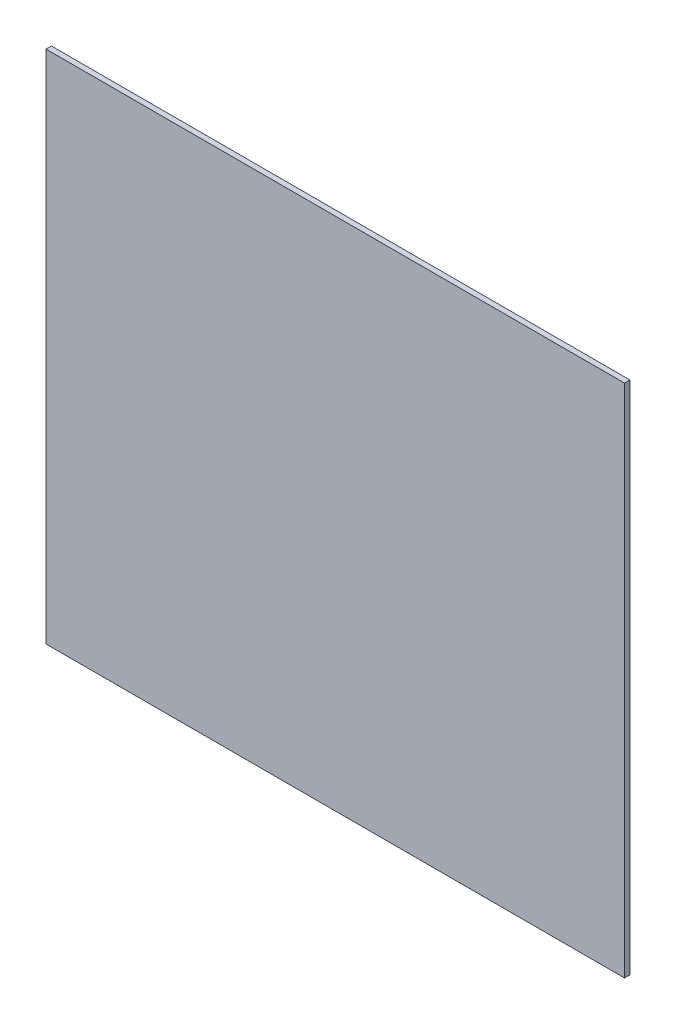
ISO-10303-21;
HEADER;
FILE_DESCRIPTION(('STEP AP214'),'2;1');
FILE_NAME('part.step','',(''),(''),'','','');
FILE_SCHEMA(('AUTOMOTIVE_DESIGN { 1 0 10303 214 1 1 1 1 }'));
ENDSEC;
DATA;
#1=APPLICATION_CONTEXT('core data for automotive mechanical design processes');
#2=APPLICATION_PROTOCOL_DEFINITION('international standard','automotive_design',2000,#1);
#3=PRODUCT_CONTEXT('',#1,'mechanical');
#4=PRODUCT('Part','Part','',(#3));
#5=PRODUCT_RELATED_PRODUCT_CATEGORY('part','',(#4));
#6=PRODUCT_DEFINITION_FORMATION('','',#4);
#7=PRODUCT_DEFINITION_CONTEXT('part definition',#1,'design');
#8=PRODUCT_DEFINITION('design','',#6,#7);
#9=PRODUCT_DEFINITION_SHAPE('','',#8);
#10=(LENGTH_UNIT() NAMED_UNIT(*) SI_UNIT(.MILLI.,.METRE.));
#11=(NAMED_UNIT(*) PLANE_ANGLE_UNIT() SI_UNIT($,.RADIAN.));
#12=(NAMED_UNIT(*) SI_UNIT($,.STERADIAN.) SOLID_ANGLE_UNIT());
#13=UNCERTAINTY_MEASURE_WITH_UNIT(LENGTH_MEASURE(1.E-05),#10,'distance_accuracy_value','');
#14=(GEOMETRIC_REPRESENTATION_CONTEXT(3) GLOBAL_UNCERTAINTY_ASSIGNED_CONTEXT((#13)) GLOBAL_UNIT_ASSIGNED_CONTEXT((#10,
#11,#12)) REPRESENTATION_CONTEXT('',''));
#15=CARTESIAN_POINT('',(0.,0.,0.));
#16=DIRECTION('',(0.,0.,1.));
#17=DIRECTION('',(1.,0.,0.));
#18=AXIS2_PLACEMENT_3D('',#15,#16,#17);
#19=CARTESIAN_POINT('',(160.,-142.5,3.));
#20=DIRECTION('',(-1.,0.,0.));
#21=DIRECTION('',(0.,0.,1.));
#22=AXIS2_PLACEMENT_3D('',#19,#20,#21);
#23=PLANE('',#22);
#24=DIRECTION('',(0.,1.,0.));
#25=VECTOR('',#24,1.);
#26=CARTESIAN_POINT('',(160.,-142.5,0.));
#27=LINE('',#26,#25);
#28=CARTESIAN_POINT('',(160.,-142.5,0.));
#29=VERTEX_POINT('',#28);
#30=CARTESIAN_POINT('',(160.,142.5,0.));
#31=VERTEX_POINT('',#30);
#32=EDGE_CURVE('E96',#29,#31,#27,.T.);
#33=ORIENTED_EDGE('',*,*,#32,.T.);
#34=DIRECTION('',(0.,0.,-1.));
#35=VECTOR('',#34,1.);
#36=CARTESIAN_POINT('',(160.,142.5,3.));
#37=LINE('',#36,#35);
#38=CARTESIAN_POINT('',(160.,142.5,3.));
#39=VERTEX_POINT('',#38);
#40=EDGE_CURVE('E11',#39,#31,#37,.T.);
#41=ORIENTED_EDGE('',*,*,#40,.F.);
#42=DIRECTION('',(0.,1.,0.));
#43=VECTOR('',#42,1.);
#44=CARTESIAN_POINT('',(160.,-142.5,3.));
#45=LINE('',#44,#43);
#46=CARTESIAN_POINT('',(160.,-142.5,3.));
#47=VERTEX_POINT('',#46);
#48=EDGE_CURVE('E84',#47,#39,#45,.T.);
#49=ORIENTED_EDGE('',*,*,#48,.F.);
#50=DIRECTION('',(0.,0.,-1.));
#51=VECTOR('',#50,1.);
#52=CARTESIAN_POINT('',(160.,-142.5,3.));
#53=LINE('',#52,#51);
#54=EDGE_CURVE('E92',#47,#29,#53,.T.);
#55=ORIENTED_EDGE('',*,*,#54,.T.);
#56=EDGE_LOOP('',(#33,#41,#49,#55));
#57=FACE_BOUND('',#56,.T.);
#58=ADVANCED_FACE('F33',(#57),#23,.F.);
#59=CARTESIAN_POINT('',(-160.,142.5,3.));
#60=DIRECTION('',(0.,-1.,0.));
#61=DIRECTION('',(0.,0.,-1.));
#62=AXIS2_PLACEMENT_3D('',#59,#60,#61);
#63=PLANE('',#62);
#64=DIRECTION('',(-1.,0.,0.));
#65=VECTOR('',#64,1.);
#66=CARTESIAN_POINT('',(-160.,142.5,0.));
#67=LINE('',#66,#65);
#68=CARTESIAN_POINT('',(-160.,142.5,0.));
#69=VERTEX_POINT('',#68);
#70=EDGE_CURVE('E88',#31,#69,#67,.T.);
#71=ORIENTED_EDGE('',*,*,#70,.T.);
#72=DIRECTION('',(0.,0.,-1.));
#73=VECTOR('',#72,1.);
#74=CARTESIAN_POINT('',(-160.,142.5,3.));
#75=LINE('',#74,#73);
#76=CARTESIAN_POINT('',(-160.,142.5,3.));
#77=VERTEX_POINT('',#76);
#78=EDGE_CURVE('E41',#77,#69,#75,.T.);
#79=ORIENTED_EDGE('',*,*,#78,.F.);
#80=DIRECTION('',(-1.,0.,0.));
#81=VECTOR('',#80,1.);
#82=CARTESIAN_POINT('',(-160.,142.5,3.));
#83=LINE('',#82,#81);
#84=EDGE_CURVE('E79',#39,#77,#83,.T.);
#85=ORIENTED_EDGE('',*,*,#84,.F.);
#86=ORIENTED_EDGE('',*,*,#40,.T.);
#87=EDGE_LOOP('',(#71,#79,#85,#86));
#88=FACE_BOUND('',#87,.T.);
#89=ADVANCED_FACE('F87',(#88),#63,.F.);
#90=CARTESIAN_POINT('',(-160.,-142.5,3.));
#91=DIRECTION('',(1.,0.,0.));
#92=DIRECTION('',(0.,0.,-1.));
#93=AXIS2_PLACEMENT_3D('',#90,#91,#92);
#94=PLANE('',#93);
#95=DIRECTION('',(0.,-1.,0.));
#96=VECTOR('',#95,1.);
#97=CARTESIAN_POINT('',(-160.,-142.5,0.));
#98=LINE('',#97,#96);
#99=CARTESIAN_POINT('',(-160.,-142.5,0.));
#100=VERTEX_POINT('',#99);
#101=EDGE_CURVE('E66',#69,#100,#98,.T.);
#102=ORIENTED_EDGE('',*,*,#101,.T.);
#103=DIRECTION('',(0.,0.,-1.));
#104=VECTOR('',#103,1.);
#105=CARTESIAN_POINT('',(-160.,-142.5,3.));
#106=LINE('',#105,#104);
#107=CARTESIAN_POINT('',(-160.,-142.5,3.));
#108=VERTEX_POINT('',#107);
#109=EDGE_CURVE('E89',#108,#100,#106,.T.);
#110=ORIENTED_EDGE('',*,*,#109,.F.);
#111=DIRECTION('',(0.,-1.,0.));
#112=VECTOR('',#111,1.);
#113=CARTESIAN_POINT('',(-160.,-142.5,3.));
#114=LINE('',#113,#112);
#115=EDGE_CURVE('E82',#77,#108,#114,.T.);
#116=ORIENTED_EDGE('',*,*,#115,.F.);
#117=ORIENTED_EDGE('',*,*,#78,.T.);
#118=EDGE_LOOP('',(#102,#110,#116,#117));
#119=FACE_BOUND('',#118,.T.);
#120=ADVANCED_FACE('F90',(#119),#94,.F.);
#121=CARTESIAN_POINT('',(-160.,-142.5,3.));
#122=DIRECTION('',(0.,1.,0.));
#123=DIRECTION('',(0.,0.,1.));
#124=AXIS2_PLACEMENT_3D('',#121,#122,#123);
#125=PLANE('',#124);
#126=DIRECTION('',(1.,0.,0.));
#127=VECTOR('',#126,1.);
#128=CARTESIAN_POINT('',(-160.,-142.5,0.));
#129=LINE('',#128,#127);
#130=EDGE_CURVE('E72',#100,#29,#129,.T.);
#131=ORIENTED_EDGE('',*,*,#130,.T.);
#132=ORIENTED_EDGE('',*,*,#54,.F.);
#133=DIRECTION('',(1.,0.,0.));
#134=VECTOR('',#133,1.);
#135=CARTESIAN_POINT('',(-160.,-142.5,3.));
#136=LINE('',#135,#134);
#137=EDGE_CURVE('E49',#108,#47,#136,.T.);
#138=ORIENTED_EDGE('',*,*,#137,.F.);
#139=ORIENTED_EDGE('',*,*,#109,.T.);
#140=EDGE_LOOP('',(#131,#132,#138,#139));
#141=FACE_BOUND('',#140,.T.);
#142=ADVANCED_FACE('F103',(#141),#125,.F.);
#143=CARTESIAN_POINT('',(0.,0.,3.));
#144=DIRECTION('',(0.,0.,-1.));
#145=DIRECTION('',(-1.,0.,0.));
#146=AXIS2_PLACEMENT_3D('',#143,#144,#145);
#147=PLANE('',#146);
#148=ORIENTED_EDGE('',*,*,#48,.T.);
#149=ORIENTED_EDGE('',*,*,#84,.T.);
#150=ORIENTED_EDGE('',*,*,#115,.T.);
#151=ORIENTED_EDGE('',*,*,#137,.T.);
#152=EDGE_LOOP('',(#148,#149,#150,#151));
#153=FACE_BOUND('',#152,.T.);
#154=ADVANCED_FACE('F80',(#153),#147,.F.);
#155=CARTESIAN_POINT('',(0.,0.,0.));
#156=DIRECTION('',(0.,0.,-1.));
#157=DIRECTION('',(-1.,0.,0.));
#158=AXIS2_PLACEMENT_3D('',#155,#156,#157);
#159=PLANE('',#158);
#160=ORIENTED_EDGE('',*,*,#32,.F.);
#161=ORIENTED_EDGE('',*,*,#130,.F.);
#162=ORIENTED_EDGE('',*,*,#101,.F.);
#163=ORIENTED_EDGE('',*,*,#70,.F.);
#164=EDGE_LOOP('',(#160,#161,#162,#163));
#165=FACE_BOUND('',#164,.T.);
#166=ADVANCED_FACE('F106',(#165),#159,.T.);
#167=CLOSED_SHELL('',(#58,#89,#120,#142,#154,#166));
#168=MANIFOLD_SOLID_BREP('B2',#167);
#169=ADVANCED_BREP_SHAPE_REPRESENTATION('',(#18,#168),#14);
#170=SHAPE_DEFINITION_REPRESENTATION(#9,#169);
ENDSEC;
END-ISO-10303-21;
